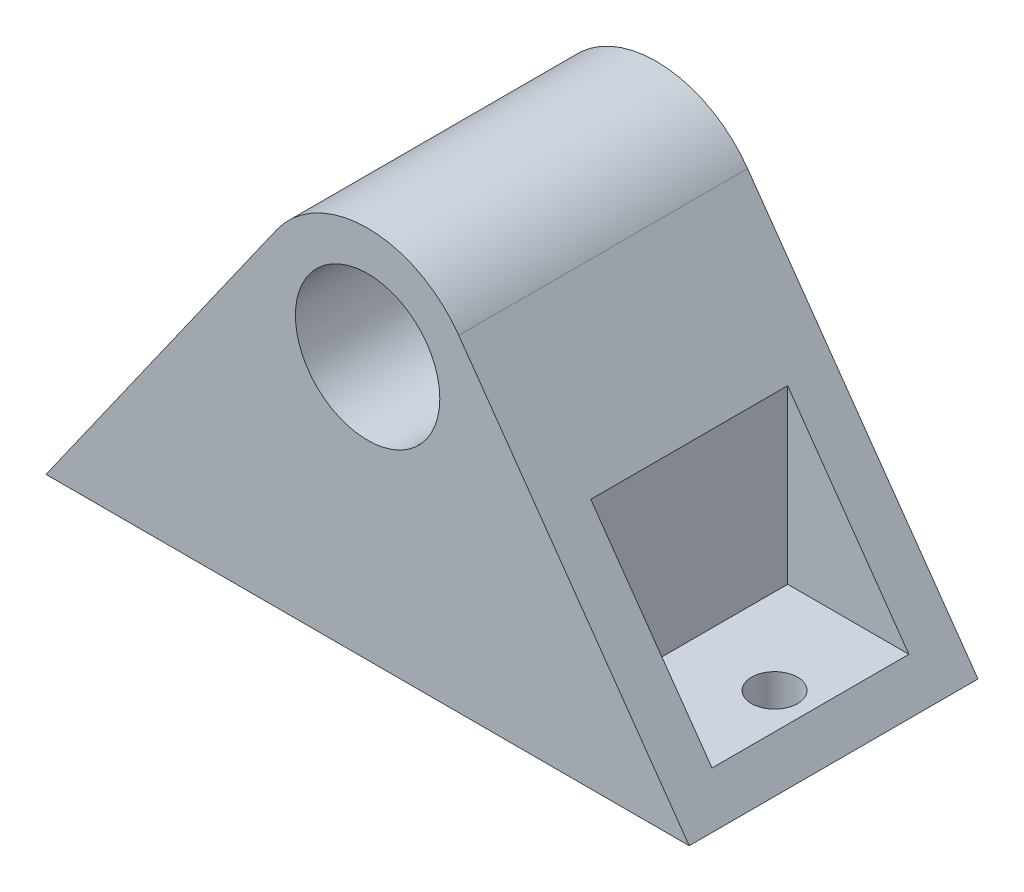
ISO-10303-21;
HEADER;
FILE_DESCRIPTION(('STEP AP214'),'2;1');
FILE_NAME('part.step','',(''),(''),'','','');
FILE_SCHEMA(('AUTOMOTIVE_DESIGN { 1 0 10303 214 1 1 1 1 }'));
ENDSEC;
DATA;
#1=APPLICATION_CONTEXT('core data for automotive mechanical design processes');
#2=APPLICATION_PROTOCOL_DEFINITION('international standard','automotive_design',2000,#1);
#3=PRODUCT_CONTEXT('',#1,'mechanical');
#4=PRODUCT('Part','Part','',(#3));
#5=PRODUCT_RELATED_PRODUCT_CATEGORY('part','',(#4));
#6=PRODUCT_DEFINITION_FORMATION('','',#4);
#7=PRODUCT_DEFINITION_CONTEXT('part definition',#1,'design');
#8=PRODUCT_DEFINITION('design','',#6,#7);
#9=PRODUCT_DEFINITION_SHAPE('','',#8);
#10=(LENGTH_UNIT() NAMED_UNIT(*) SI_UNIT(.MILLI.,.METRE.));
#11=(NAMED_UNIT(*) PLANE_ANGLE_UNIT() SI_UNIT($,.RADIAN.));
#12=(NAMED_UNIT(*) SI_UNIT($,.STERADIAN.) SOLID_ANGLE_UNIT());
#13=UNCERTAINTY_MEASURE_WITH_UNIT(LENGTH_MEASURE(1.E-05),#10,'distance_accuracy_value','');
#14=(GEOMETRIC_REPRESENTATION_CONTEXT(3) GLOBAL_UNCERTAINTY_ASSIGNED_CONTEXT((#13)) GLOBAL_UNIT_ASSIGNED_CONTEXT((#10,
#11,#12)) REPRESENTATION_CONTEXT('',''));
#15=CARTESIAN_POINT('',(0.,0.,0.));
#16=DIRECTION('',(0.,0.,1.));
#17=DIRECTION('',(1.,0.,0.));
#18=AXIS2_PLACEMENT_3D('',#15,#16,#17);
#19=CARTESIAN_POINT('',(16.3657938287145,11.5378828716327,11.));
#20=DIRECTION('',(-0.817307521588715,-0.576201713946177,0.));
#21=DIRECTION('',(0.576201713946177,-0.817307521588715,0.));
#22=AXIS2_PLACEMENT_3D('',#19,#20,#21);
#23=PLANE('',#22);
#24=DIRECTION('',(0.,0.,-1.));
#25=VECTOR('',#24,1.);
#26=CARTESIAN_POINT('',(22.7375002715437,2.5,11.));
#27=LINE('',#26,#25);
#28=CARTESIAN_POINT('',(22.7375002715437,2.5,7.5));
#29=VERTEX_POINT('',#28);
#30=CARTESIAN_POINT('',(22.7375002715437,2.5,-7.5));
#31=VERTEX_POINT('',#30);
#32=EDGE_CURVE('E124',#29,#31,#27,.T.);
#33=ORIENTED_EDGE('',*,*,#32,.F.);
#34=DIRECTION('',(-0.576201713946177,0.817307521588716,0.));
#35=VECTOR('',#34,1.);
#36=CARTESIAN_POINT('',(16.3657938287145,11.5378828716327,7.5));
#37=LINE('',#36,#35);
#38=CARTESIAN_POINT('',(13.5,15.6028392833203,7.5));
#39=VERTEX_POINT('',#38);
#40=EDGE_CURVE('E11',#29,#39,#37,.T.);
#41=ORIENTED_EDGE('',*,*,#40,.T.);
#42=DIRECTION('',(0.,0.,-1.));
#43=VECTOR('',#42,1.);
#44=CARTESIAN_POINT('',(13.5,15.6028392833203,11.));
#45=LINE('',#44,#43);
#46=CARTESIAN_POINT('',(13.5,15.6028392833203,-7.5));
#47=VERTEX_POINT('',#46);
#48=EDGE_CURVE('E49',#39,#47,#45,.T.);
#49=ORIENTED_EDGE('',*,*,#48,.T.);
#50=DIRECTION('',(0.576201713946177,-0.817307521588716,0.));
#51=VECTOR('',#50,1.);
#52=CARTESIAN_POINT('',(16.3657938287145,11.5378828716327,-7.5));
#53=LINE('',#52,#51);
#54=EDGE_CURVE('E133',#47,#31,#53,.T.);
#55=ORIENTED_EDGE('',*,*,#54,.T.);
#56=EDGE_LOOP('',(#33,#41,#49,#55));
#57=FACE_BOUND('',#56,.T.);
#58=DIRECTION('',(-0.576201713946177,0.817307521588716,0.));
#59=VECTOR('',#58,1.);
#60=CARTESIAN_POINT('',(16.3657938287145,11.5378828716327,-11.));
#61=LINE('',#60,#59);
#62=CARTESIAN_POINT('',(24.5,0.,-11.));
#63=VERTEX_POINT('',#62);
#64=CARTESIAN_POINT('',(6.94711393350407,24.8977145685425,-11.));
#65=VERTEX_POINT('',#64);
#66=EDGE_CURVE('E148',#63,#65,#61,.T.);
#67=ORIENTED_EDGE('',*,*,#66,.T.);
#68=DIRECTION('',(0.,0.,-1.));
#69=VECTOR('',#68,1.);
#70=CARTESIAN_POINT('',(6.94711393350407,24.8977145685425,11.));
#71=LINE('',#70,#69);
#72=CARTESIAN_POINT('',(6.94711393350407,24.8977145685425,11.));
#73=VERTEX_POINT('',#72);
#74=EDGE_CURVE('E212',#73,#65,#71,.T.);
#75=ORIENTED_EDGE('',*,*,#74,.F.);
#76=DIRECTION('',(-0.576201713946177,0.817307521588716,0.));
#77=VECTOR('',#76,1.);
#78=CARTESIAN_POINT('',(16.3657938287145,11.5378828716327,11.));
#79=LINE('',#78,#77);
#80=CARTESIAN_POINT('',(24.5,0.,11.));
#81=VERTEX_POINT('',#80);
#82=EDGE_CURVE('E166',#81,#73,#79,.T.);
#83=ORIENTED_EDGE('',*,*,#82,.F.);
#84=DIRECTION('',(0.,0.,-1.));
#85=VECTOR('',#84,1.);
#86=CARTESIAN_POINT('',(24.5,0.,11.));
#87=LINE('',#86,#85);
#88=EDGE_CURVE('E185',#81,#63,#87,.T.);
#89=ORIENTED_EDGE('',*,*,#88,.T.);
#90=EDGE_LOOP('',(#67,#75,#83,#89));
#91=FACE_BOUND('',#90,.T.);
#92=ADVANCED_FACE('F41',(#57,#91),#23,.F.);
#93=CARTESIAN_POINT('',(0.,20.,11.));
#94=DIRECTION('',(0.,0.,-1.));
#95=DIRECTION('',(-1.,0.,0.));
#96=AXIS2_PLACEMENT_3D('',#93,#94,#95);
#97=CYLINDRICAL_SURFACE('',#96,8.5);
#98=CARTESIAN_POINT('',(0.,20.,-11.));
#99=DIRECTION('',(0.,0.,1.));
#100=DIRECTION('',(1.,0.,0.));
#101=AXIS2_PLACEMENT_3D('',#98,#99,#100);
#102=CIRCLE('',#101,8.5);
#103=CARTESIAN_POINT('',(-6.94711393350408,24.8977145685425,-11.));
#104=VERTEX_POINT('',#103);
#105=EDGE_CURVE('E189',#65,#104,#102,.T.);
#106=ORIENTED_EDGE('',*,*,#105,.T.);
#107=DIRECTION('',(0.,0.,-1.));
#108=VECTOR('',#107,1.);
#109=CARTESIAN_POINT('',(-6.94711393350408,24.8977145685425,11.));
#110=LINE('',#109,#108);
#111=CARTESIAN_POINT('',(-6.94711393350408,24.8977145685425,11.));
#112=VERTEX_POINT('',#111);
#113=EDGE_CURVE('E209',#112,#104,#110,.T.);
#114=ORIENTED_EDGE('',*,*,#113,.F.);
#115=CARTESIAN_POINT('',(0.,20.,11.));
#116=DIRECTION('',(0.,0.,1.));
#117=DIRECTION('',(1.,0.,0.));
#118=AXIS2_PLACEMENT_3D('',#115,#116,#117);
#119=CIRCLE('',#118,8.5);
#120=EDGE_CURVE('E170',#73,#112,#119,.T.);
#121=ORIENTED_EDGE('',*,*,#120,.F.);
#122=ORIENTED_EDGE('',*,*,#74,.T.);
#123=EDGE_LOOP('',(#106,#114,#121,#122));
#124=FACE_BOUND('',#123,.T.);
#125=ADVANCED_FACE('F249',(#124),#97,.T.);
#126=CARTESIAN_POINT('',(-16.3657938287145,11.5378828716327,11.));
#127=DIRECTION('',(-0.817307521588716,0.576201713946176,0.));
#128=DIRECTION('',(-0.576201713946176,-0.817307521588716,0.));
#129=AXIS2_PLACEMENT_3D('',#126,#127,#128);
#130=PLANE('',#129);
#131=DIRECTION('',(-0.576201713946176,-0.817307521588716,0.));
#132=VECTOR('',#131,1.);
#133=CARTESIAN_POINT('',(-16.3657938287145,11.5378828716327,-7.5));
#134=LINE('',#133,#132);
#135=CARTESIAN_POINT('',(-13.5,15.6028392833203,-7.5));
#136=VERTEX_POINT('',#135);
#137=CARTESIAN_POINT('',(-22.7375002715437,2.5,-7.50000000000001));
#138=VERTEX_POINT('',#137);
#139=EDGE_CURVE('E225',#136,#138,#134,.T.);
#140=ORIENTED_EDGE('',*,*,#139,.F.);
#141=DIRECTION('',(0.,0.,-1.));
#142=VECTOR('',#141,1.);
#143=CARTESIAN_POINT('',(-13.5,15.6028392833203,11.));
#144=LINE('',#143,#142);
#145=CARTESIAN_POINT('',(-13.5,15.6028392833203,7.49999999999999));
#146=VERTEX_POINT('',#145);
#147=EDGE_CURVE('E222',#146,#136,#144,.T.);
#148=ORIENTED_EDGE('',*,*,#147,.F.);
#149=DIRECTION('',(0.576201713946176,0.817307521588716,0.));
#150=VECTOR('',#149,1.);
#151=CARTESIAN_POINT('',(-16.3657938287145,11.5378828716327,7.49999999999999));
#152=LINE('',#151,#150);
#153=CARTESIAN_POINT('',(-22.7375002715437,2.5,7.49999999999999));
#154=VERTEX_POINT('',#153);
#155=EDGE_CURVE('E219',#154,#146,#152,.T.);
#156=ORIENTED_EDGE('',*,*,#155,.F.);
#157=DIRECTION('',(0.,0.,1.));
#158=VECTOR('',#157,1.);
#159=CARTESIAN_POINT('',(-22.7375002715437,2.5,11.));
#160=LINE('',#159,#158);
#161=EDGE_CURVE('E216',#138,#154,#160,.T.);
#162=ORIENTED_EDGE('',*,*,#161,.F.);
#163=EDGE_LOOP('',(#140,#148,#156,#162));
#164=FACE_BOUND('',#163,.T.);
#165=DIRECTION('',(0.576201713946176,0.817307521588716,0.));
#166=VECTOR('',#165,1.);
#167=CARTESIAN_POINT('',(-16.3657938287145,11.5378828716327,-11.));
#168=LINE('',#167,#166);
#169=CARTESIAN_POINT('',(-24.5,0.,-11.));
#170=VERTEX_POINT('',#169);
#171=EDGE_CURVE('E193',#170,#104,#168,.T.);
#172=ORIENTED_EDGE('',*,*,#171,.F.);
#173=DIRECTION('',(0.,0.,-1.));
#174=VECTOR('',#173,1.);
#175=CARTESIAN_POINT('',(-24.5,0.,11.));
#176=LINE('',#175,#174);
#177=CARTESIAN_POINT('',(-24.5,0.,11.));
#178=VERTEX_POINT('',#177);
#179=EDGE_CURVE('E206',#178,#170,#176,.T.);
#180=ORIENTED_EDGE('',*,*,#179,.F.);
#181=DIRECTION('',(0.576201713946176,0.817307521588716,0.));
#182=VECTOR('',#181,1.);
#183=CARTESIAN_POINT('',(-16.3657938287145,11.5378828716327,11.));
#184=LINE('',#183,#182);
#185=EDGE_CURVE('E174',#178,#112,#184,.T.);
#186=ORIENTED_EDGE('',*,*,#185,.T.);
#187=ORIENTED_EDGE('',*,*,#113,.T.);
#188=EDGE_LOOP('',(#172,#180,#186,#187));
#189=FACE_BOUND('',#188,.T.);
#190=ADVANCED_FACE('F253',(#164,#189),#130,.T.);
#191=CARTESIAN_POINT('',(0.,0.,11.));
#192=DIRECTION('',(0.,1.,0.));
#193=DIRECTION('',(-1.,0.,0.));
#194=AXIS2_PLACEMENT_3D('',#191,#192,#193);
#195=PLANE('',#194);
#196=CARTESIAN_POINT('',(20.,0.,0.));
#197=DIRECTION('',(0.,1.,0.));
#198=DIRECTION('',(0.,0.,1.));
#199=AXIS2_PLACEMENT_3D('',#196,#197,#198);
#200=CIRCLE('',#199,1.75);
#201=CARTESIAN_POINT('',(20.,0.,1.75));
#202=VERTEX_POINT('',#201);
#203=EDGE_CURVE('E154',#202,#202,#200,.T.);
#204=ORIENTED_EDGE('',*,*,#203,.T.);
#205=EDGE_LOOP('',(#204));
#206=FACE_BOUND('',#205,.T.);
#207=CARTESIAN_POINT('',(-20.,0.,0.));
#208=DIRECTION('',(0.,1.,0.));
#209=DIRECTION('',(0.,0.,-1.));
#210=AXIS2_PLACEMENT_3D('',#207,#208,#209);
#211=CIRCLE('',#210,1.75);
#212=CARTESIAN_POINT('',(-20.,0.,-1.75000000000001));
#213=VERTEX_POINT('',#212);
#214=EDGE_CURVE('E309',#213,#213,#211,.T.);
#215=ORIENTED_EDGE('',*,*,#214,.T.);
#216=EDGE_LOOP('',(#215));
#217=FACE_BOUND('',#216,.T.);
#218=DIRECTION('',(1.,0.,0.));
#219=VECTOR('',#218,1.);
#220=CARTESIAN_POINT('',(0.,0.,-11.));
#221=LINE('',#220,#219);
#222=EDGE_CURVE('E197',#170,#63,#221,.T.);
#223=ORIENTED_EDGE('',*,*,#222,.T.);
#224=ORIENTED_EDGE('',*,*,#88,.F.);
#225=DIRECTION('',(1.,0.,0.));
#226=VECTOR('',#225,1.);
#227=CARTESIAN_POINT('',(0.,0.,11.));
#228=LINE('',#227,#226);
#229=EDGE_CURVE('E178',#178,#81,#228,.T.);
#230=ORIENTED_EDGE('',*,*,#229,.F.);
#231=ORIENTED_EDGE('',*,*,#179,.T.);
#232=EDGE_LOOP('',(#223,#224,#230,#231));
#233=FACE_BOUND('',#232,.T.);
#234=ADVANCED_FACE('F258',(#206,#217,#233),#195,.F.);
#235=CARTESIAN_POINT('',(0.,20.,11.));
#236=DIRECTION('',(0.,0.,-1.));
#237=DIRECTION('',(-1.,0.,0.));
#238=AXIS2_PLACEMENT_3D('',#235,#236,#237);
#239=CYLINDRICAL_SURFACE('',#238,5.5);
#240=CARTESIAN_POINT('',(0.,20.,11.));
#241=DIRECTION('',(0.,0.,1.));
#242=DIRECTION('',(1.,0.,0.));
#243=AXIS2_PLACEMENT_3D('',#240,#241,#242);
#244=CIRCLE('',#243,5.5);
#245=CARTESIAN_POINT('',(5.5,20.,11.));
#246=VERTEX_POINT('',#245);
#247=EDGE_CURVE('E181',#246,#246,#244,.T.);
#248=ORIENTED_EDGE('',*,*,#247,.T.);
#249=EDGE_LOOP('',(#248));
#250=FACE_BOUND('',#249,.T.);
#251=CARTESIAN_POINT('',(0.,20.,-11.));
#252=DIRECTION('',(0.,0.,1.));
#253=DIRECTION('',(1.,0.,0.));
#254=AXIS2_PLACEMENT_3D('',#251,#252,#253);
#255=CIRCLE('',#254,5.5);
#256=CARTESIAN_POINT('',(5.5,20.,-11.));
#257=VERTEX_POINT('',#256);
#258=EDGE_CURVE('E171',#257,#257,#255,.T.);
#259=ORIENTED_EDGE('',*,*,#258,.F.);
#260=EDGE_LOOP('',(#259));
#261=FACE_BOUND('',#260,.T.);
#262=ADVANCED_FACE('F264',(#250,#261),#239,.F.);
#263=CARTESIAN_POINT('',(0.,0.,11.));
#264=DIRECTION('',(0.,0.,1.));
#265=DIRECTION('',(1.,0.,0.));
#266=AXIS2_PLACEMENT_3D('',#263,#264,#265);
#267=PLANE('',#266);
#268=ORIENTED_EDGE('',*,*,#82,.T.);
#269=ORIENTED_EDGE('',*,*,#120,.T.);
#270=ORIENTED_EDGE('',*,*,#185,.F.);
#271=ORIENTED_EDGE('',*,*,#229,.T.);
#272=EDGE_LOOP('',(#268,#269,#270,#271));
#273=FACE_BOUND('',#272,.T.);
#274=ORIENTED_EDGE('',*,*,#247,.F.);
#275=EDGE_LOOP('',(#274));
#276=FACE_BOUND('',#275,.T.);
#277=ADVANCED_FACE('F268',(#273,#276),#267,.T.);
#278=CARTESIAN_POINT('',(0.,0.,-11.));
#279=DIRECTION('',(0.,0.,1.));
#280=DIRECTION('',(1.,0.,0.));
#281=AXIS2_PLACEMENT_3D('',#278,#279,#280);
#282=PLANE('',#281);
#283=ORIENTED_EDGE('',*,*,#66,.F.);
#284=ORIENTED_EDGE('',*,*,#222,.F.);
#285=ORIENTED_EDGE('',*,*,#171,.T.);
#286=ORIENTED_EDGE('',*,*,#105,.F.);
#287=EDGE_LOOP('',(#283,#284,#285,#286));
#288=FACE_BOUND('',#287,.T.);
#289=ORIENTED_EDGE('',*,*,#258,.T.);
#290=EDGE_LOOP('',(#289));
#291=FACE_BOUND('',#290,.T.);
#292=ADVANCED_FACE('F270',(#288,#291),#282,.F.);
#293=CARTESIAN_POINT('',(-24.5,2.5,-7.50000000000001));
#294=DIRECTION('',(0.,0.,-1.));
#295=DIRECTION('',(-1.,0.,0.));
#296=AXIS2_PLACEMENT_3D('',#293,#294,#295);
#297=PLANE('',#296);
#298=ORIENTED_EDGE('',*,*,#139,.T.);
#299=DIRECTION('',(-1.,0.,0.));
#300=VECTOR('',#299,1.);
#301=CARTESIAN_POINT('',(-24.5,2.5,-7.50000000000001));
#302=LINE('',#301,#300);
#303=CARTESIAN_POINT('',(-13.5,2.5,-7.5));
#304=VERTEX_POINT('',#303);
#305=EDGE_CURVE('E64',#304,#138,#302,.T.);
#306=ORIENTED_EDGE('',*,*,#305,.F.);
#307=DIRECTION('',(0.,1.,0.));
#308=VECTOR('',#307,1.);
#309=CARTESIAN_POINT('',(-13.5,2.5,-7.5));
#310=LINE('',#309,#308);
#311=EDGE_CURVE('E128',#304,#136,#310,.T.);
#312=ORIENTED_EDGE('',*,*,#311,.T.);
#313=EDGE_LOOP('',(#298,#306,#312));
#314=FACE_BOUND('',#313,.T.);
#315=ADVANCED_FACE('F273',(#314),#297,.F.);
#316=CARTESIAN_POINT('',(-13.5,2.5,7.49999999999999));
#317=DIRECTION('',(1.,0.,0.));
#318=DIRECTION('',(0.,0.,-1.));
#319=AXIS2_PLACEMENT_3D('',#316,#317,#318);
#320=PLANE('',#319);
#321=ORIENTED_EDGE('',*,*,#147,.T.);
#322=ORIENTED_EDGE('',*,*,#311,.F.);
#323=DIRECTION('',(0.,0.,-1.));
#324=VECTOR('',#323,1.);
#325=CARTESIAN_POINT('',(-13.5,2.5,7.49999999999999));
#326=LINE('',#325,#324);
#327=CARTESIAN_POINT('',(-13.5,2.5,7.49999999999999));
#328=VERTEX_POINT('',#327);
#329=EDGE_CURVE('E153',#328,#304,#326,.T.);
#330=ORIENTED_EDGE('',*,*,#329,.F.);
#331=DIRECTION('',(0.,1.,0.));
#332=VECTOR('',#331,1.);
#333=CARTESIAN_POINT('',(-13.5,2.5,7.49999999999999));
#334=LINE('',#333,#332);
#335=EDGE_CURVE('E159',#328,#146,#334,.T.);
#336=ORIENTED_EDGE('',*,*,#335,.T.);
#337=EDGE_LOOP('',(#321,#322,#330,#336));
#338=FACE_BOUND('',#337,.T.);
#339=ADVANCED_FACE('F280',(#338),#320,.F.);
#340=CARTESIAN_POINT('',(-24.5,2.5,7.49999999999999));
#341=DIRECTION('',(0.,0.,1.));
#342=DIRECTION('',(1.,0.,0.));
#343=AXIS2_PLACEMENT_3D('',#340,#341,#342);
#344=PLANE('',#343);
#345=ORIENTED_EDGE('',*,*,#155,.T.);
#346=ORIENTED_EDGE('',*,*,#335,.F.);
#347=DIRECTION('',(1.,0.,0.));
#348=VECTOR('',#347,1.);
#349=CARTESIAN_POINT('',(-24.5,2.5,7.49999999999999));
#350=LINE('',#349,#348);
#351=EDGE_CURVE('E150',#154,#328,#350,.T.);
#352=ORIENTED_EDGE('',*,*,#351,.F.);
#353=EDGE_LOOP('',(#345,#346,#352));
#354=FACE_BOUND('',#353,.T.);
#355=ADVANCED_FACE('F244',(#354),#344,.F.);
#356=CARTESIAN_POINT('',(0.,2.5,0.));
#357=DIRECTION('',(0.,-1.,0.));
#358=DIRECTION('',(0.,0.,-1.));
#359=AXIS2_PLACEMENT_3D('',#356,#357,#358);
#360=PLANE('',#359);
#361=CARTESIAN_POINT('',(-20.,2.5,0.));
#362=DIRECTION('',(0.,1.,0.));
#363=DIRECTION('',(0.,0.,-1.));
#364=AXIS2_PLACEMENT_3D('',#361,#362,#363);
#365=CIRCLE('',#364,1.75);
#366=CARTESIAN_POINT('',(-20.,2.5,-1.75000000000001));
#367=VERTEX_POINT('',#366);
#368=EDGE_CURVE('E312',#367,#367,#365,.T.);
#369=ORIENTED_EDGE('',*,*,#368,.F.);
#370=EDGE_LOOP('',(#369));
#371=FACE_BOUND('',#370,.T.);
#372=ORIENTED_EDGE('',*,*,#161,.T.);
#373=ORIENTED_EDGE('',*,*,#351,.T.);
#374=ORIENTED_EDGE('',*,*,#329,.T.);
#375=ORIENTED_EDGE('',*,*,#305,.T.);
#376=EDGE_LOOP('',(#372,#373,#374,#375));
#377=FACE_BOUND('',#376,.T.);
#378=ADVANCED_FACE('F237',(#371,#377),#360,.F.);
#379=CARTESIAN_POINT('',(24.5,2.5,7.5));
#380=DIRECTION('',(0.,0.,1.));
#381=DIRECTION('',(1.,0.,0.));
#382=AXIS2_PLACEMENT_3D('',#379,#380,#381);
#383=PLANE('',#382);
#384=DIRECTION('',(1.,0.,0.));
#385=VECTOR('',#384,1.);
#386=CARTESIAN_POINT('',(24.5,2.5,7.5));
#387=LINE('',#386,#385);
#388=CARTESIAN_POINT('',(13.5,2.5,7.5));
#389=VERTEX_POINT('',#388);
#390=EDGE_CURVE('E56',#389,#29,#387,.T.);
#391=ORIENTED_EDGE('',*,*,#390,.F.);
#392=DIRECTION('',(0.,1.,0.));
#393=VECTOR('',#392,1.);
#394=CARTESIAN_POINT('',(13.5,2.5,7.5));
#395=LINE('',#394,#393);
#396=EDGE_CURVE('E137',#389,#39,#395,.T.);
#397=ORIENTED_EDGE('',*,*,#396,.T.);
#398=ORIENTED_EDGE('',*,*,#40,.F.);
#399=EDGE_LOOP('',(#391,#397,#398));
#400=FACE_BOUND('',#399,.T.);
#401=ADVANCED_FACE('F235',(#400),#383,.F.);
#402=CARTESIAN_POINT('',(13.5,2.5,7.5));
#403=DIRECTION('',(-1.,0.,0.));
#404=DIRECTION('',(0.,0.,1.));
#405=AXIS2_PLACEMENT_3D('',#402,#403,#404);
#406=PLANE('',#405);
#407=ORIENTED_EDGE('',*,*,#396,.F.);
#408=DIRECTION('',(0.,0.,1.));
#409=VECTOR('',#408,1.);
#410=CARTESIAN_POINT('',(13.5,2.5,7.5));
#411=LINE('',#410,#409);
#412=CARTESIAN_POINT('',(13.5,2.5,-7.5));
#413=VERTEX_POINT('',#412);
#414=EDGE_CURVE('E122',#413,#389,#411,.T.);
#415=ORIENTED_EDGE('',*,*,#414,.F.);
#416=DIRECTION('',(0.,1.,0.));
#417=VECTOR('',#416,1.);
#418=CARTESIAN_POINT('',(13.5,2.5,-7.5));
#419=LINE('',#418,#417);
#420=EDGE_CURVE('E131',#413,#47,#419,.T.);
#421=ORIENTED_EDGE('',*,*,#420,.T.);
#422=ORIENTED_EDGE('',*,*,#48,.F.);
#423=EDGE_LOOP('',(#407,#415,#421,#422));
#424=FACE_BOUND('',#423,.T.);
#425=ADVANCED_FACE('F139',(#424),#406,.F.);
#426=CARTESIAN_POINT('',(24.5,2.5,-7.5));
#427=DIRECTION('',(0.,0.,-1.));
#428=DIRECTION('',(-1.,0.,0.));
#429=AXIS2_PLACEMENT_3D('',#426,#427,#428);
#430=PLANE('',#429);
#431=ORIENTED_EDGE('',*,*,#420,.F.);
#432=DIRECTION('',(-1.,0.,0.));
#433=VECTOR('',#432,1.);
#434=CARTESIAN_POINT('',(24.5,2.5,-7.5));
#435=LINE('',#434,#433);
#436=EDGE_CURVE('E118',#31,#413,#435,.T.);
#437=ORIENTED_EDGE('',*,*,#436,.F.);
#438=ORIENTED_EDGE('',*,*,#54,.F.);
#439=EDGE_LOOP('',(#431,#437,#438));
#440=FACE_BOUND('',#439,.T.);
#441=ADVANCED_FACE('F132',(#440),#430,.F.);
#442=CARTESIAN_POINT('',(0.,2.5,0.));
#443=DIRECTION('',(0.,1.,0.));
#444=DIRECTION('',(0.,0.,1.));
#445=AXIS2_PLACEMENT_3D('',#442,#443,#444);
#446=PLANE('',#445);
#447=CARTESIAN_POINT('',(20.,2.5,0.));
#448=DIRECTION('',(0.,1.,0.));
#449=DIRECTION('',(0.,0.,1.));
#450=AXIS2_PLACEMENT_3D('',#447,#448,#449);
#451=CIRCLE('',#450,1.75);
#452=CARTESIAN_POINT('',(20.,2.5,1.75));
#453=VERTEX_POINT('',#452);
#454=EDGE_CURVE('E315',#453,#453,#451,.T.);
#455=ORIENTED_EDGE('',*,*,#454,.F.);
#456=EDGE_LOOP('',(#455));
#457=FACE_BOUND('',#456,.T.);
#458=ORIENTED_EDGE('',*,*,#32,.T.);
#459=ORIENTED_EDGE('',*,*,#436,.T.);
#460=ORIENTED_EDGE('',*,*,#414,.T.);
#461=ORIENTED_EDGE('',*,*,#390,.T.);
#462=EDGE_LOOP('',(#458,#459,#460,#461));
#463=FACE_BOUND('',#462,.T.);
#464=ADVANCED_FACE('F120',(#457,#463),#446,.T.);
#465=CARTESIAN_POINT('',(20.,0.,0.));
#466=DIRECTION('',(0.,1.,0.));
#467=DIRECTION('',(0.,0.,1.));
#468=AXIS2_PLACEMENT_3D('',#465,#466,#467);
#469=CYLINDRICAL_SURFACE('',#468,1.75);
#470=ORIENTED_EDGE('',*,*,#203,.F.);
#471=EDGE_LOOP('',(#470));
#472=FACE_BOUND('',#471,.T.);
#473=ORIENTED_EDGE('',*,*,#454,.T.);
#474=EDGE_LOOP('',(#473));
#475=FACE_BOUND('',#474,.T.);
#476=ADVANCED_FACE('F292',(#472,#475),#469,.F.);
#477=CARTESIAN_POINT('',(-20.,0.,0.));
#478=DIRECTION('',(0.,1.,0.));
#479=DIRECTION('',(0.,0.,1.));
#480=AXIS2_PLACEMENT_3D('',#477,#478,#479);
#481=CYLINDRICAL_SURFACE('',#480,1.75);
#482=ORIENTED_EDGE('',*,*,#214,.F.);
#483=EDGE_LOOP('',(#482));
#484=FACE_BOUND('',#483,.T.);
#485=ORIENTED_EDGE('',*,*,#368,.T.);
#486=EDGE_LOOP('',(#485));
#487=FACE_BOUND('',#486,.T.);
#488=ADVANCED_FACE('F297',(#484,#487),#481,.F.);
#489=CLOSED_SHELL('',(#92,#125,#190,#234,#262,#277,#292,#315,#339,#355,#378,#401,#425,#441,#464,
#476,#488));
#490=MANIFOLD_SOLID_BREP('B2',#489);
#491=ADVANCED_BREP_SHAPE_REPRESENTATION('',(#18,#490),#14);
#492=SHAPE_DEFINITION_REPRESENTATION(#9,#491);
ENDSEC;
END-ISO-10303-21;
